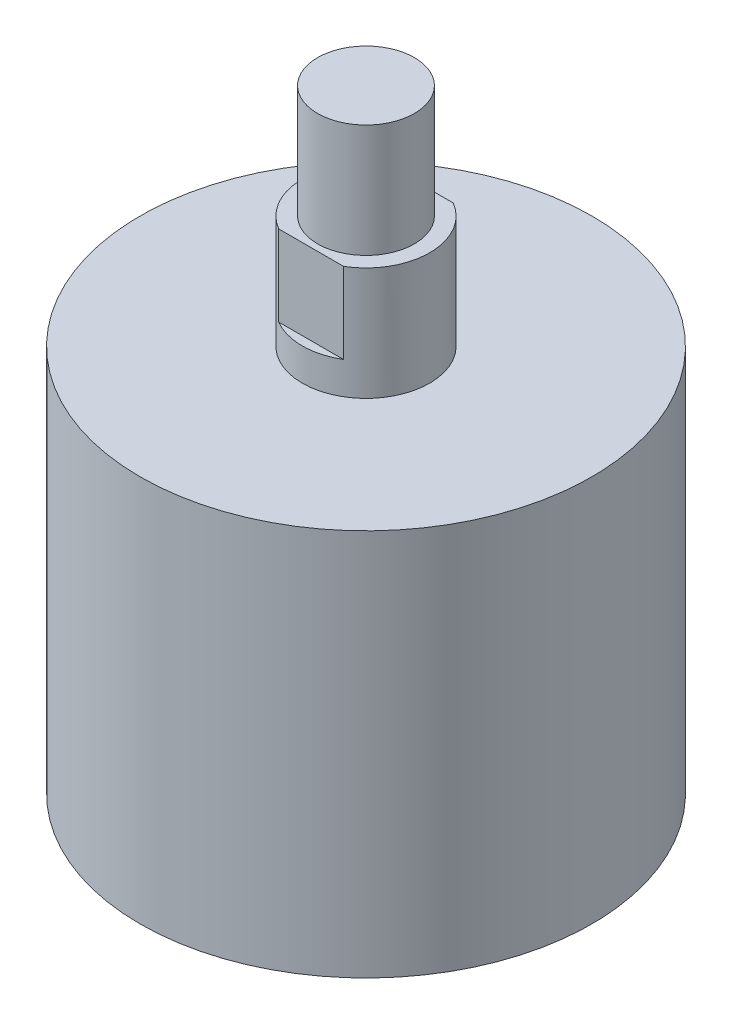
ISO-10303-21;
HEADER;
FILE_DESCRIPTION(('STEP AP214'),'2;1');
FILE_NAME('part.step','',(''),(''),'','','');
FILE_SCHEMA(('AUTOMOTIVE_DESIGN { 1 0 10303 214 1 1 1 1 }'));
ENDSEC;
DATA;
#1=APPLICATION_CONTEXT('core data for automotive mechanical design processes');
#2=APPLICATION_PROTOCOL_DEFINITION('international standard','automotive_design',2000,#1);
#3=PRODUCT_CONTEXT('',#1,'mechanical');
#4=PRODUCT('Part','Part','',(#3));
#5=PRODUCT_RELATED_PRODUCT_CATEGORY('part','',(#4));
#6=PRODUCT_DEFINITION_FORMATION('','',#4);
#7=PRODUCT_DEFINITION_CONTEXT('part definition',#1,'design');
#8=PRODUCT_DEFINITION('design','',#6,#7);
#9=PRODUCT_DEFINITION_SHAPE('','',#8);
#10=(LENGTH_UNIT() NAMED_UNIT(*) SI_UNIT(.MILLI.,.METRE.));
#11=(NAMED_UNIT(*) PLANE_ANGLE_UNIT() SI_UNIT($,.RADIAN.));
#12=(NAMED_UNIT(*) SI_UNIT($,.STERADIAN.) SOLID_ANGLE_UNIT());
#13=UNCERTAINTY_MEASURE_WITH_UNIT(LENGTH_MEASURE(1.E-05),#10,'distance_accuracy_value','');
#14=(GEOMETRIC_REPRESENTATION_CONTEXT(3) GLOBAL_UNCERTAINTY_ASSIGNED_CONTEXT((#13)) GLOBAL_UNIT_ASSIGNED_CONTEXT((#10,
#11,#12)) REPRESENTATION_CONTEXT('',''));
#15=CARTESIAN_POINT('',(0.,0.,0.));
#16=DIRECTION('',(0.,0.,1.));
#17=DIRECTION('',(1.,0.,0.));
#18=AXIS2_PLACEMENT_3D('',#15,#16,#17);
#19=CARTESIAN_POINT('',(0.,24.,0.));
#20=DIRECTION('',(0.,-1.,0.));
#21=DIRECTION('',(0.,0.,-1.));
#22=AXIS2_PLACEMENT_3D('',#19,#20,#21);
#23=CYLINDRICAL_SURFACE('',#22,14.);
#24=CARTESIAN_POINT('',(0.,24.,0.));
#25=DIRECTION('',(0.,1.,0.));
#26=DIRECTION('',(0.,0.,1.));
#27=AXIS2_PLACEMENT_3D('',#24,#25,#26);
#28=CIRCLE('',#27,14.);
#29=CARTESIAN_POINT('',(0.,24.,14.));
#30=VERTEX_POINT('',#29);
#31=EDGE_CURVE('E109',#30,#30,#28,.T.);
#32=ORIENTED_EDGE('',*,*,#31,.F.);
#33=EDGE_LOOP('',(#32));
#34=FACE_BOUND('',#33,.T.);
#35=CARTESIAN_POINT('',(0.,0.,0.));
#36=DIRECTION('',(0.,1.,0.));
#37=DIRECTION('',(0.,0.,1.));
#38=AXIS2_PLACEMENT_3D('',#35,#36,#37);
#39=CIRCLE('',#38,14.);
#40=CARTESIAN_POINT('',(0.,0.,14.));
#41=VERTEX_POINT('',#40);
#42=EDGE_CURVE('E105',#41,#41,#39,.T.);
#43=ORIENTED_EDGE('',*,*,#42,.T.);
#44=EDGE_LOOP('',(#43));
#45=FACE_BOUND('',#44,.T.);
#46=ADVANCED_FACE('F46',(#34,#45),#23,.T.);
#47=CARTESIAN_POINT('',(0.,24.,0.));
#48=DIRECTION('',(0.,1.,0.));
#49=DIRECTION('',(0.,0.,1.));
#50=AXIS2_PLACEMENT_3D('',#47,#48,#49);
#51=PLANE('',#50);
#52=CARTESIAN_POINT('',(0.,24.,0.));
#53=DIRECTION('',(0.,1.,0.));
#54=DIRECTION('',(0.,0.,1.));
#55=AXIS2_PLACEMENT_3D('',#52,#53,#54);
#56=CIRCLE('',#55,3.95);
#57=CARTESIAN_POINT('',(0.,24.,3.95));
#58=VERTEX_POINT('',#57);
#59=EDGE_CURVE('E114',#58,#58,#56,.T.);
#60=ORIENTED_EDGE('',*,*,#59,.F.);
#61=EDGE_LOOP('',(#60));
#62=FACE_BOUND('',#61,.T.);
#63=ORIENTED_EDGE('',*,*,#31,.T.);
#64=EDGE_LOOP('',(#63));
#65=FACE_BOUND('',#64,.T.);
#66=ADVANCED_FACE('F120',(#62,#65),#51,.T.);
#67=CARTESIAN_POINT('',(0.,0.,0.));
#68=DIRECTION('',(0.,1.,0.));
#69=DIRECTION('',(0.,0.,1.));
#70=AXIS2_PLACEMENT_3D('',#67,#68,#69);
#71=PLANE('',#70);
#72=CARTESIAN_POINT('',(0.,0.,0.));
#73=DIRECTION('',(0.,1.,0.));
#74=DIRECTION('',(0.,0.,1.));
#75=AXIS2_PLACEMENT_3D('',#72,#73,#74);
#76=CIRCLE('',#75,3.);
#77=CARTESIAN_POINT('',(0.,0.,3.));
#78=VERTEX_POINT('',#77);
#79=EDGE_CURVE('E13',#78,#78,#76,.F.);
#80=ORIENTED_EDGE('',*,*,#79,.F.);
#81=EDGE_LOOP('',(#80));
#82=FACE_BOUND('',#81,.T.);
#83=CARTESIAN_POINT('',(8.,0.,0.));
#84=DIRECTION('',(0.,-1.,0.));
#85=DIRECTION('',(0.,0.,-1.));
#86=AXIS2_PLACEMENT_3D('',#83,#84,#85);
#87=CIRCLE('',#86,1.25);
#88=CARTESIAN_POINT('',(8.,0.,-1.25));
#89=VERTEX_POINT('',#88);
#90=EDGE_CURVE('E225',#89,#89,#87,.T.);
#91=ORIENTED_EDGE('',*,*,#90,.F.);
#92=EDGE_LOOP('',(#91));
#93=FACE_BOUND('',#92,.T.);
#94=CARTESIAN_POINT('',(0.,0.,-8.));
#95=DIRECTION('',(0.,-1.,0.));
#96=DIRECTION('',(0.,0.,-1.));
#97=AXIS2_PLACEMENT_3D('',#94,#95,#96);
#98=CIRCLE('',#97,1.25);
#99=CARTESIAN_POINT('',(0.,0.,-9.25));
#100=VERTEX_POINT('',#99);
#101=EDGE_CURVE('E231',#100,#100,#98,.T.);
#102=ORIENTED_EDGE('',*,*,#101,.F.);
#103=EDGE_LOOP('',(#102));
#104=FACE_BOUND('',#103,.T.);
#105=CARTESIAN_POINT('',(-8.,0.,0.));
#106=DIRECTION('',(0.,-1.,0.));
#107=DIRECTION('',(0.,0.,-1.));
#108=AXIS2_PLACEMENT_3D('',#105,#106,#107);
#109=CIRCLE('',#108,1.25);
#110=CARTESIAN_POINT('',(-8.,0.,-1.25));
#111=VERTEX_POINT('',#110);
#112=EDGE_CURVE('E237',#111,#111,#109,.T.);
#113=ORIENTED_EDGE('',*,*,#112,.F.);
#114=EDGE_LOOP('',(#113));
#115=FACE_BOUND('',#114,.T.);
#116=CARTESIAN_POINT('',(0.,0.,8.));
#117=DIRECTION('',(0.,-1.,0.));
#118=DIRECTION('',(0.,0.,-1.));
#119=AXIS2_PLACEMENT_3D('',#116,#117,#118);
#120=CIRCLE('',#119,1.25);
#121=CARTESIAN_POINT('',(0.,0.,6.75));
#122=VERTEX_POINT('',#121);
#123=EDGE_CURVE('E221',#122,#122,#120,.T.);
#124=ORIENTED_EDGE('',*,*,#123,.F.);
#125=EDGE_LOOP('',(#124));
#126=FACE_BOUND('',#125,.T.);
#127=ORIENTED_EDGE('',*,*,#42,.F.);
#128=EDGE_LOOP('',(#127));
#129=FACE_BOUND('',#128,.T.);
#130=ADVANCED_FACE('F126',(#82,#93,#104,#115,#126,#129),#71,.F.);
#131=CARTESIAN_POINT('',(0.,31.,0.));
#132=DIRECTION('',(0.,-1.,0.));
#133=DIRECTION('',(0.,0.,-1.));
#134=AXIS2_PLACEMENT_3D('',#131,#132,#133);
#135=CYLINDRICAL_SURFACE('',#134,3.95);
#136=CARTESIAN_POINT('',(0.,31.,0.));
#137=DIRECTION('',(0.,1.,0.));
#138=DIRECTION('',(0.,0.,1.));
#139=AXIS2_PLACEMENT_3D('',#136,#137,#138);
#140=CIRCLE('',#139,3.95);
#141=CARTESIAN_POINT('',(-2.01059692628831,31.,-3.4));
#142=VERTEX_POINT('',#141);
#143=CARTESIAN_POINT('',(-2.01059692628831,31.,3.4));
#144=VERTEX_POINT('',#143);
#145=EDGE_CURVE('E106',#142,#144,#140,.T.);
#146=ORIENTED_EDGE('',*,*,#145,.F.);
#147=DIRECTION('',(0.,1.,0.));
#148=VECTOR('',#147,1.);
#149=CARTESIAN_POINT('',(-2.01059692628831,19.9413672252839,-3.4));
#150=LINE('',#149,#148);
#151=CARTESIAN_POINT('',(-2.01059692628831,26.,-3.4));
#152=VERTEX_POINT('',#151);
#153=EDGE_CURVE('E60',#152,#142,#150,.T.);
#154=ORIENTED_EDGE('',*,*,#153,.F.);
#155=CARTESIAN_POINT('',(0.,26.,0.));
#156=DIRECTION('',(0.,1.,0.));
#157=DIRECTION('',(0.,0.,1.));
#158=AXIS2_PLACEMENT_3D('',#155,#156,#157);
#159=CIRCLE('',#158,3.95);
#160=CARTESIAN_POINT('',(2.01059692628831,26.,-3.4));
#161=VERTEX_POINT('',#160);
#162=EDGE_CURVE('E101',#152,#161,#159,.F.);
#163=ORIENTED_EDGE('',*,*,#162,.T.);
#164=DIRECTION('',(0.,1.,0.));
#165=VECTOR('',#164,1.);
#166=CARTESIAN_POINT('',(2.01059692628831,19.9413672252839,-3.4));
#167=LINE('',#166,#165);
#168=CARTESIAN_POINT('',(2.01059692628831,31.,-3.4));
#169=VERTEX_POINT('',#168);
#170=EDGE_CURVE('E86',#161,#169,#167,.T.);
#171=ORIENTED_EDGE('',*,*,#170,.T.);
#172=CARTESIAN_POINT('',(2.01059692628831,31.,3.4));
#173=VERTEX_POINT('',#172);
#174=EDGE_CURVE('E99',#173,#169,#140,.T.);
#175=ORIENTED_EDGE('',*,*,#174,.F.);
#176=DIRECTION('',(0.,1.,0.));
#177=VECTOR('',#176,1.);
#178=CARTESIAN_POINT('',(2.01059692628831,19.9413672252839,3.4));
#179=LINE('',#178,#177);
#180=CARTESIAN_POINT('',(2.01059692628831,26.,3.4));
#181=VERTEX_POINT('',#180);
#182=EDGE_CURVE('E68',#181,#173,#179,.T.);
#183=ORIENTED_EDGE('',*,*,#182,.F.);
#184=CARTESIAN_POINT('',(0.,26.,0.));
#185=DIRECTION('',(0.,1.,0.));
#186=DIRECTION('',(0.,0.,1.));
#187=AXIS2_PLACEMENT_3D('',#184,#185,#186);
#188=CIRCLE('',#187,3.95);
#189=CARTESIAN_POINT('',(-2.01059692628831,26.,3.4));
#190=VERTEX_POINT('',#189);
#191=EDGE_CURVE('E212',#181,#190,#188,.F.);
#192=ORIENTED_EDGE('',*,*,#191,.T.);
#193=DIRECTION('',(0.,1.,0.));
#194=VECTOR('',#193,1.);
#195=CARTESIAN_POINT('',(-2.01059692628831,19.9413672252839,3.4));
#196=LINE('',#195,#194);
#197=EDGE_CURVE('E214',#190,#144,#196,.T.);
#198=ORIENTED_EDGE('',*,*,#197,.T.);
#199=EDGE_LOOP('',(#146,#154,#163,#171,#175,#183,#192,#198));
#200=FACE_BOUND('',#199,.T.);
#201=ORIENTED_EDGE('',*,*,#59,.T.);
#202=EDGE_LOOP('',(#201));
#203=FACE_BOUND('',#202,.T.);
#204=ADVANCED_FACE('F97',(#200,#203),#135,.T.);
#205=CARTESIAN_POINT('',(0.,31.,0.));
#206=DIRECTION('',(0.,1.,0.));
#207=DIRECTION('',(0.,0.,1.));
#208=AXIS2_PLACEMENT_3D('',#205,#206,#207);
#209=PLANE('',#208);
#210=DIRECTION('',(1.,0.,0.));
#211=VECTOR('',#210,1.);
#212=CARTESIAN_POINT('',(-2.01059692628831,31.,-3.4));
#213=LINE('',#212,#211);
#214=EDGE_CURVE('E83',#142,#169,#213,.T.);
#215=ORIENTED_EDGE('',*,*,#214,.F.);
#216=ORIENTED_EDGE('',*,*,#145,.T.);
#217=DIRECTION('',(-1.,0.,0.));
#218=VECTOR('',#217,1.);
#219=CARTESIAN_POINT('',(-2.01059692628831,31.,3.4));
#220=LINE('',#219,#218);
#221=EDGE_CURVE('E92',#173,#144,#220,.T.);
#222=ORIENTED_EDGE('',*,*,#221,.F.);
#223=ORIENTED_EDGE('',*,*,#174,.T.);
#224=EDGE_LOOP('',(#215,#216,#222,#223));
#225=FACE_BOUND('',#224,.T.);
#226=CARTESIAN_POINT('',(0.,31.,0.));
#227=DIRECTION('',(0.,1.,0.));
#228=DIRECTION('',(0.,0.,1.));
#229=AXIS2_PLACEMENT_3D('',#226,#227,#228);
#230=CIRCLE('',#229,3.);
#231=CARTESIAN_POINT('',(0.,31.,3.));
#232=VERTEX_POINT('',#231);
#233=EDGE_CURVE('E53',#232,#232,#230,.T.);
#234=ORIENTED_EDGE('',*,*,#233,.F.);
#235=EDGE_LOOP('',(#234));
#236=FACE_BOUND('',#235,.T.);
#237=ADVANCED_FACE('F103',(#225,#236),#209,.T.);
#238=CARTESIAN_POINT('',(0.,38.,0.));
#239=DIRECTION('',(0.,-1.,0.));
#240=DIRECTION('',(0.,0.,-1.));
#241=AXIS2_PLACEMENT_3D('',#238,#239,#240);
#242=CYLINDRICAL_SURFACE('',#241,3.);
#243=CARTESIAN_POINT('',(0.,38.,0.));
#244=DIRECTION('',(0.,1.,0.));
#245=DIRECTION('',(0.,0.,1.));
#246=AXIS2_PLACEMENT_3D('',#243,#244,#245);
#247=CIRCLE('',#246,3.);
#248=CARTESIAN_POINT('',(0.,38.,3.));
#249=VERTEX_POINT('',#248);
#250=EDGE_CURVE('E110',#249,#249,#247,.T.);
#251=ORIENTED_EDGE('',*,*,#250,.F.);
#252=EDGE_LOOP('',(#251));
#253=FACE_BOUND('',#252,.T.);
#254=ORIENTED_EDGE('',*,*,#233,.T.);
#255=EDGE_LOOP('',(#254));
#256=FACE_BOUND('',#255,.T.);
#257=ADVANCED_FACE('F141',(#253,#256),#242,.T.);
#258=CARTESIAN_POINT('',(0.,38.,0.));
#259=DIRECTION('',(0.,1.,0.));
#260=DIRECTION('',(0.,0.,1.));
#261=AXIS2_PLACEMENT_3D('',#258,#259,#260);
#262=PLANE('',#261);
#263=ORIENTED_EDGE('',*,*,#250,.T.);
#264=EDGE_LOOP('',(#263));
#265=FACE_BOUND('',#264,.T.);
#266=ADVANCED_FACE('F144',(#265),#262,.T.);
#267=CARTESIAN_POINT('',(0.,5.,8.));
#268=DIRECTION('',(0.,-1.,0.));
#269=DIRECTION('',(0.,0.,-1.));
#270=AXIS2_PLACEMENT_3D('',#267,#268,#269);
#271=CYLINDRICAL_SURFACE('',#270,1.25);
#272=CARTESIAN_POINT('',(0.,5.,8.));
#273=DIRECTION('',(0.,-1.,0.));
#274=DIRECTION('',(0.,0.,-1.));
#275=AXIS2_PLACEMENT_3D('',#272,#273,#274);
#276=CIRCLE('',#275,1.25);
#277=CARTESIAN_POINT('',(0.,5.,6.75));
#278=VERTEX_POINT('',#277);
#279=EDGE_CURVE('E240',#278,#278,#276,.T.);
#280=ORIENTED_EDGE('',*,*,#279,.F.);
#281=EDGE_LOOP('',(#280));
#282=FACE_BOUND('',#281,.T.);
#283=ORIENTED_EDGE('',*,*,#123,.T.);
#284=EDGE_LOOP('',(#283));
#285=FACE_BOUND('',#284,.T.);
#286=ADVANCED_FACE('F148',(#282,#285),#271,.F.);
#287=CARTESIAN_POINT('',(0.,5.,8.));
#288=DIRECTION('',(0.,-1.,0.));
#289=DIRECTION('',(0.,0.,-1.));
#290=AXIS2_PLACEMENT_3D('',#287,#288,#289);
#291=PLANE('',#290);
#292=ORIENTED_EDGE('',*,*,#279,.T.);
#293=EDGE_LOOP('',(#292));
#294=FACE_BOUND('',#293,.T.);
#295=ADVANCED_FACE('F152',(#294),#291,.T.);
#296=CARTESIAN_POINT('',(-8.,5.,0.));
#297=DIRECTION('',(0.,-1.,0.));
#298=DIRECTION('',(0.,0.,-1.));
#299=AXIS2_PLACEMENT_3D('',#296,#297,#298);
#300=CYLINDRICAL_SURFACE('',#299,1.25);
#301=CARTESIAN_POINT('',(-8.,5.,0.));
#302=DIRECTION('',(0.,-1.,0.));
#303=DIRECTION('',(0.,0.,-1.));
#304=AXIS2_PLACEMENT_3D('',#301,#302,#303);
#305=CIRCLE('',#304,1.25);
#306=CARTESIAN_POINT('',(-8.,5.,-1.25));
#307=VERTEX_POINT('',#306);
#308=EDGE_CURVE('E234',#307,#307,#305,.T.);
#309=ORIENTED_EDGE('',*,*,#308,.F.);
#310=EDGE_LOOP('',(#309));
#311=FACE_BOUND('',#310,.T.);
#312=ORIENTED_EDGE('',*,*,#112,.T.);
#313=EDGE_LOOP('',(#312));
#314=FACE_BOUND('',#313,.T.);
#315=ADVANCED_FACE('F156',(#311,#314),#300,.F.);
#316=CARTESIAN_POINT('',(-8.,5.,0.));
#317=DIRECTION('',(0.,-1.,0.));
#318=DIRECTION('',(0.,0.,-1.));
#319=AXIS2_PLACEMENT_3D('',#316,#317,#318);
#320=PLANE('',#319);
#321=ORIENTED_EDGE('',*,*,#308,.T.);
#322=EDGE_LOOP('',(#321));
#323=FACE_BOUND('',#322,.T.);
#324=ADVANCED_FACE('F160',(#323),#320,.T.);
#325=CARTESIAN_POINT('',(0.,5.,-8.));
#326=DIRECTION('',(0.,-1.,0.));
#327=DIRECTION('',(0.,0.,-1.));
#328=AXIS2_PLACEMENT_3D('',#325,#326,#327);
#329=CYLINDRICAL_SURFACE('',#328,1.25);
#330=CARTESIAN_POINT('',(0.,5.,-8.));
#331=DIRECTION('',(0.,-1.,0.));
#332=DIRECTION('',(0.,0.,-1.));
#333=AXIS2_PLACEMENT_3D('',#330,#331,#332);
#334=CIRCLE('',#333,1.25);
#335=CARTESIAN_POINT('',(0.,5.,-9.25));
#336=VERTEX_POINT('',#335);
#337=EDGE_CURVE('E228',#336,#336,#334,.T.);
#338=ORIENTED_EDGE('',*,*,#337,.F.);
#339=EDGE_LOOP('',(#338));
#340=FACE_BOUND('',#339,.T.);
#341=ORIENTED_EDGE('',*,*,#101,.T.);
#342=EDGE_LOOP('',(#341));
#343=FACE_BOUND('',#342,.T.);
#344=ADVANCED_FACE('F164',(#340,#343),#329,.F.);
#345=CARTESIAN_POINT('',(0.,5.,-8.));
#346=DIRECTION('',(0.,-1.,0.));
#347=DIRECTION('',(0.,0.,-1.));
#348=AXIS2_PLACEMENT_3D('',#345,#346,#347);
#349=PLANE('',#348);
#350=ORIENTED_EDGE('',*,*,#337,.T.);
#351=EDGE_LOOP('',(#350));
#352=FACE_BOUND('',#351,.T.);
#353=ADVANCED_FACE('F168',(#352),#349,.T.);
#354=CARTESIAN_POINT('',(8.,5.,0.));
#355=DIRECTION('',(0.,-1.,0.));
#356=DIRECTION('',(0.,0.,-1.));
#357=AXIS2_PLACEMENT_3D('',#354,#355,#356);
#358=CYLINDRICAL_SURFACE('',#357,1.25);
#359=CARTESIAN_POINT('',(8.,5.,0.));
#360=DIRECTION('',(0.,-1.,0.));
#361=DIRECTION('',(0.,0.,-1.));
#362=AXIS2_PLACEMENT_3D('',#359,#360,#361);
#363=CIRCLE('',#362,1.25);
#364=CARTESIAN_POINT('',(8.,5.,-1.25));
#365=VERTEX_POINT('',#364);
#366=EDGE_CURVE('E222',#365,#365,#363,.T.);
#367=ORIENTED_EDGE('',*,*,#366,.F.);
#368=EDGE_LOOP('',(#367));
#369=FACE_BOUND('',#368,.T.);
#370=ORIENTED_EDGE('',*,*,#90,.T.);
#371=EDGE_LOOP('',(#370));
#372=FACE_BOUND('',#371,.T.);
#373=ADVANCED_FACE('F172',(#369,#372),#358,.F.);
#374=CARTESIAN_POINT('',(8.,5.,0.));
#375=DIRECTION('',(0.,-1.,0.));
#376=DIRECTION('',(0.,0.,-1.));
#377=AXIS2_PLACEMENT_3D('',#374,#375,#376);
#378=PLANE('',#377);
#379=ORIENTED_EDGE('',*,*,#366,.T.);
#380=EDGE_LOOP('',(#379));
#381=FACE_BOUND('',#380,.T.);
#382=ADVANCED_FACE('F176',(#381),#378,.T.);
#383=CARTESIAN_POINT('',(0.,-3.,0.));
#384=DIRECTION('',(0.,1.,0.));
#385=DIRECTION('',(0.,0.,1.));
#386=AXIS2_PLACEMENT_3D('',#383,#384,#385);
#387=CYLINDRICAL_SURFACE('',#386,3.);
#388=CARTESIAN_POINT('',(0.,-3.,0.));
#389=DIRECTION('',(0.,-1.,0.));
#390=DIRECTION('',(0.,0.,-1.));
#391=AXIS2_PLACEMENT_3D('',#388,#389,#390);
#392=CIRCLE('',#391,3.);
#393=CARTESIAN_POINT('',(0.,-3.,-3.));
#394=VERTEX_POINT('',#393);
#395=EDGE_CURVE('E209',#394,#394,#392,.T.);
#396=ORIENTED_EDGE('',*,*,#395,.F.);
#397=EDGE_LOOP('',(#396));
#398=FACE_BOUND('',#397,.T.);
#399=ORIENTED_EDGE('',*,*,#79,.T.);
#400=EDGE_LOOP('',(#399));
#401=FACE_BOUND('',#400,.T.);
#402=ADVANCED_FACE('F180',(#398,#401),#387,.T.);
#403=CARTESIAN_POINT('',(0.,-3.,0.));
#404=DIRECTION('',(0.,-1.,0.));
#405=DIRECTION('',(0.,0.,-1.));
#406=AXIS2_PLACEMENT_3D('',#403,#404,#405);
#407=PLANE('',#406);
#408=ORIENTED_EDGE('',*,*,#395,.T.);
#409=EDGE_LOOP('',(#408));
#410=FACE_BOUND('',#409,.T.);
#411=ADVANCED_FACE('F184',(#410),#407,.T.);
#412=CARTESIAN_POINT('',(-2.01059692628831,19.9413672252839,3.4));
#413=DIRECTION('',(0.,0.,-1.));
#414=DIRECTION('',(-1.,0.,0.));
#415=AXIS2_PLACEMENT_3D('',#412,#413,#414);
#416=PLANE('',#415);
#417=DIRECTION('',(1.,0.,0.));
#418=VECTOR('',#417,1.);
#419=CARTESIAN_POINT('',(-2.01059692628831,26.,3.4));
#420=LINE('',#419,#418);
#421=EDGE_CURVE('E210',#190,#181,#420,.T.);
#422=ORIENTED_EDGE('',*,*,#421,.T.);
#423=ORIENTED_EDGE('',*,*,#182,.T.);
#424=ORIENTED_EDGE('',*,*,#221,.T.);
#425=ORIENTED_EDGE('',*,*,#197,.F.);
#426=EDGE_LOOP('',(#422,#423,#424,#425));
#427=FACE_BOUND('',#426,.T.);
#428=ADVANCED_FACE('F188',(#427),#416,.F.);
#429=CARTESIAN_POINT('',(0.,26.,0.));
#430=DIRECTION('',(0.,1.,0.));
#431=DIRECTION('',(0.,0.,1.));
#432=AXIS2_PLACEMENT_3D('',#429,#430,#431);
#433=PLANE('',#432);
#434=ORIENTED_EDGE('',*,*,#191,.F.);
#435=ORIENTED_EDGE('',*,*,#421,.F.);
#436=EDGE_LOOP('',(#434,#435));
#437=FACE_BOUND('',#436,.T.);
#438=ADVANCED_FACE('F190',(#437),#433,.T.);
#439=CARTESIAN_POINT('',(-2.01059692628831,19.9413672252839,-3.4));
#440=DIRECTION('',(0.,0.,1.));
#441=DIRECTION('',(1.,0.,0.));
#442=AXIS2_PLACEMENT_3D('',#439,#440,#441);
#443=PLANE('',#442);
#444=DIRECTION('',(-1.,0.,0.));
#445=VECTOR('',#444,1.);
#446=CARTESIAN_POINT('',(-2.01059692628831,26.,-3.4));
#447=LINE('',#446,#445);
#448=EDGE_CURVE('E203',#161,#152,#447,.T.);
#449=ORIENTED_EDGE('',*,*,#448,.T.);
#450=ORIENTED_EDGE('',*,*,#153,.T.);
#451=ORIENTED_EDGE('',*,*,#214,.T.);
#452=ORIENTED_EDGE('',*,*,#170,.F.);
#453=EDGE_LOOP('',(#449,#450,#451,#452));
#454=FACE_BOUND('',#453,.T.);
#455=ADVANCED_FACE('F85',(#454),#443,.F.);
#456=CARTESIAN_POINT('',(0.,26.,0.));
#457=DIRECTION('',(0.,1.,0.));
#458=DIRECTION('',(0.,0.,1.));
#459=AXIS2_PLACEMENT_3D('',#456,#457,#458);
#460=PLANE('',#459);
#461=ORIENTED_EDGE('',*,*,#162,.F.);
#462=ORIENTED_EDGE('',*,*,#448,.F.);
#463=EDGE_LOOP('',(#461,#462));
#464=FACE_BOUND('',#463,.T.);
#465=ADVANCED_FACE('F198',(#464),#460,.T.);
#466=CLOSED_SHELL('',(#46,#66,#130,#204,#237,#257,#266,#286,#295,#315,#324,#344,#353,#373,#382,
#402,#411,#428,#438,#455,#465));
#467=MANIFOLD_SOLID_BREP('B2',#466);
#468=ADVANCED_BREP_SHAPE_REPRESENTATION('',(#18,#467),#14);
#469=SHAPE_DEFINITION_REPRESENTATION(#9,#468);
ENDSEC;
END-ISO-10303-21;
